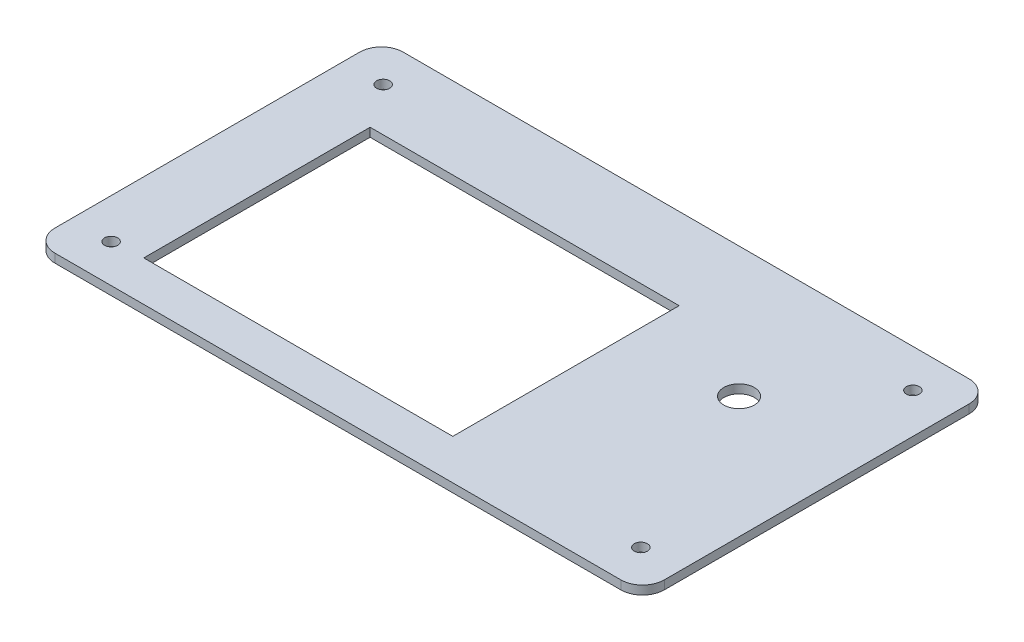
ISO-10303-21;
HEADER;
FILE_DESCRIPTION(('STEP AP214'),'2;1');
FILE_NAME('part.step','',(''),(''),'','','');
FILE_SCHEMA(('AUTOMOTIVE_DESIGN { 1 0 10303 214 1 1 1 1 }'));
ENDSEC;
DATA;
#1=APPLICATION_CONTEXT('core data for automotive mechanical design processes');
#2=APPLICATION_PROTOCOL_DEFINITION('international standard','automotive_design',2000,#1);
#3=PRODUCT_CONTEXT('',#1,'mechanical');
#4=PRODUCT('Part','Part','',(#3));
#5=PRODUCT_RELATED_PRODUCT_CATEGORY('part','',(#4));
#6=PRODUCT_DEFINITION_FORMATION('','',#4);
#7=PRODUCT_DEFINITION_CONTEXT('part definition',#1,'design');
#8=PRODUCT_DEFINITION('design','',#6,#7);
#9=PRODUCT_DEFINITION_SHAPE('','',#8);
#10=(LENGTH_UNIT() NAMED_UNIT(*) SI_UNIT(.MILLI.,.METRE.));
#11=(NAMED_UNIT(*) PLANE_ANGLE_UNIT() SI_UNIT($,.RADIAN.));
#12=(NAMED_UNIT(*) SI_UNIT($,.STERADIAN.) SOLID_ANGLE_UNIT());
#13=UNCERTAINTY_MEASURE_WITH_UNIT(LENGTH_MEASURE(1.E-05),#10,'distance_accuracy_value','');
#14=(GEOMETRIC_REPRESENTATION_CONTEXT(3) GLOBAL_UNCERTAINTY_ASSIGNED_CONTEXT((#13)) GLOBAL_UNIT_ASSIGNED_CONTEXT((#10,
#11,#12)) REPRESENTATION_CONTEXT('',''));
#15=CARTESIAN_POINT('',(0.,0.,0.));
#16=DIRECTION('',(0.,0.,1.));
#17=DIRECTION('',(1.,0.,0.));
#18=AXIS2_PLACEMENT_3D('',#15,#16,#17);
#19=CARTESIAN_POINT('',(-62.2257502177692,2.,-33.5412544692905));
#20=DIRECTION('',(0.,1.,0.));
#21=DIRECTION('',(0.,0.,1.));
#22=AXIS2_PLACEMENT_3D('',#19,#20,#21);
#23=PLANE('',#22);
#24=DIRECTION('',(1.,0.,0.));
#25=VECTOR('',#24,1.);
#26=CARTESIAN_POINT('',(-51.0757502177691,2.,32.2087455307095));
#27=LINE('',#26,#25);
#28=CARTESIAN_POINT('',(-51.0757502177691,2.,32.2087455307095));
#29=VERTEX_POINT('',#28);
#30=CARTESIAN_POINT('',(19.9242497822309,2.,32.2087455307095));
#31=VERTEX_POINT('',#30);
#32=EDGE_CURVE('E130',#29,#31,#27,.T.);
#33=ORIENTED_EDGE('',*,*,#32,.F.);
#34=DIRECTION('',(0.,0.,1.));
#35=VECTOR('',#34,1.);
#36=CARTESIAN_POINT('',(-51.0757502177692,2.,-19.7912544692905));
#37=LINE('',#36,#35);
#38=CARTESIAN_POINT('',(-51.0757502177692,2.,-19.7912544692905));
#39=VERTEX_POINT('',#38);
#40=EDGE_CURVE('E122',#39,#29,#37,.T.);
#41=ORIENTED_EDGE('',*,*,#40,.F.);
#42=DIRECTION('',(-1.,0.,0.));
#43=VECTOR('',#42,1.);
#44=CARTESIAN_POINT('',(-51.0757502177692,2.,-19.7912544692905));
#45=LINE('',#44,#43);
#46=CARTESIAN_POINT('',(19.9242497822308,2.,-19.7912544692905));
#47=VERTEX_POINT('',#46);
#48=EDGE_CURVE('E145',#47,#39,#45,.T.);
#49=ORIENTED_EDGE('',*,*,#48,.F.);
#50=DIRECTION('',(0.,0.,-1.));
#51=VECTOR('',#50,1.);
#52=CARTESIAN_POINT('',(19.9242497822308,2.,-19.7912544692905));
#53=LINE('',#52,#51);
#54=EDGE_CURVE('E143',#31,#47,#53,.T.);
#55=ORIENTED_EDGE('',*,*,#54,.F.);
#56=EDGE_LOOP('',(#33,#41,#49,#55));
#57=FACE_BOUND('',#56,.T.);
#58=CARTESIAN_POINT('',(-58.0757502177692,2.,32.7087455307095));
#59=DIRECTION('',(0.,1.,0.));
#60=DIRECTION('',(0.,0.,1.));
#61=AXIS2_PLACEMENT_3D('',#58,#59,#60);
#62=CIRCLE('',#61,1.5);
#63=CARTESIAN_POINT('',(-58.0757502177692,2.,34.2087455307095));
#64=VERTEX_POINT('',#63);
#65=EDGE_CURVE('E167',#64,#64,#62,.T.);
#66=ORIENTED_EDGE('',*,*,#65,.F.);
#67=EDGE_LOOP('',(#66));
#68=FACE_BOUND('',#67,.T.);
#69=CARTESIAN_POINT('',(-58.0757502177692,2.,-29.7912544692905));
#70=DIRECTION('',(0.,1.,0.));
#71=DIRECTION('',(0.,0.,1.));
#72=AXIS2_PLACEMENT_3D('',#69,#70,#71);
#73=CIRCLE('',#72,1.5);
#74=CARTESIAN_POINT('',(-58.0757502177692,2.,-28.2912544692905));
#75=VERTEX_POINT('',#74);
#76=EDGE_CURVE('E179',#75,#75,#73,.T.);
#77=ORIENTED_EDGE('',*,*,#76,.F.);
#78=EDGE_LOOP('',(#77));
#79=FACE_BOUND('',#78,.T.);
#80=CARTESIAN_POINT('',(-62.2257502177692,2.,-33.5412544692905));
#81=DIRECTION('',(0.,1.,0.));
#82=DIRECTION('',(0.,0.,1.));
#83=AXIS2_PLACEMENT_3D('',#80,#81,#82);
#84=CIRCLE('',#83,5.);
#85=CARTESIAN_POINT('',(-62.2257502177691,2.,-38.5412544692905));
#86=VERTEX_POINT('',#85);
#87=CARTESIAN_POINT('',(-67.2257502177692,2.,-33.5412544692904));
#88=VERTEX_POINT('',#87);
#89=EDGE_CURVE('E185',#86,#88,#84,.T.);
#90=ORIENTED_EDGE('',*,*,#89,.T.);
#91=DIRECTION('',(0.,0.,1.));
#92=VECTOR('',#91,1.);
#93=CARTESIAN_POINT('',(-67.2257502177692,2.,-33.5412544692904));
#94=LINE('',#93,#92);
#95=CARTESIAN_POINT('',(-67.2257502177692,2.,36.4587455307095));
#96=VERTEX_POINT('',#95);
#97=EDGE_CURVE('E188',#88,#96,#94,.T.);
#98=ORIENTED_EDGE('',*,*,#97,.T.);
#99=CARTESIAN_POINT('',(-62.2257502177692,2.,36.4587455307095));
#100=DIRECTION('',(0.,1.,0.));
#101=DIRECTION('',(0.,0.,-1.));
#102=AXIS2_PLACEMENT_3D('',#99,#100,#101);
#103=CIRCLE('',#102,5.);
#104=CARTESIAN_POINT('',(-62.2257502177691,2.,41.4587455307095));
#105=VERTEX_POINT('',#104);
#106=EDGE_CURVE('E191',#96,#105,#103,.T.);
#107=ORIENTED_EDGE('',*,*,#106,.T.);
#108=DIRECTION('',(1.,0.,0.));
#109=VECTOR('',#108,1.);
#110=CARTESIAN_POINT('',(-62.2257502177691,2.,41.4587455307095));
#111=LINE('',#110,#109);
#112=CARTESIAN_POINT('',(67.7742497822308,2.,41.4587455307095));
#113=VERTEX_POINT('',#112);
#114=EDGE_CURVE('E193',#105,#113,#111,.T.);
#115=ORIENTED_EDGE('',*,*,#114,.T.);
#116=CARTESIAN_POINT('',(67.7742497822308,2.,36.4587455307095));
#117=DIRECTION('',(0.,1.,0.));
#118=DIRECTION('',(0.,0.,1.));
#119=AXIS2_PLACEMENT_3D('',#116,#117,#118);
#120=CIRCLE('',#119,5.);
#121=CARTESIAN_POINT('',(72.7742497822309,2.,36.4587455307095));
#122=VERTEX_POINT('',#121);
#123=EDGE_CURVE('E195',#113,#122,#120,.T.);
#124=ORIENTED_EDGE('',*,*,#123,.T.);
#125=DIRECTION('',(0.,0.,-1.));
#126=VECTOR('',#125,1.);
#127=CARTESIAN_POINT('',(72.7742497822309,2.,-33.5412544692904));
#128=LINE('',#127,#126);
#129=CARTESIAN_POINT('',(72.7742497822309,2.,-33.5412544692904));
#130=VERTEX_POINT('',#129);
#131=EDGE_CURVE('E197',#122,#130,#128,.T.);
#132=ORIENTED_EDGE('',*,*,#131,.T.);
#133=CARTESIAN_POINT('',(67.7742497822308,2.,-33.5412544692905));
#134=DIRECTION('',(0.,1.,0.));
#135=DIRECTION('',(0.,0.,1.));
#136=AXIS2_PLACEMENT_3D('',#133,#134,#135);
#137=CIRCLE('',#136,5.);
#138=CARTESIAN_POINT('',(67.7742497822308,2.,-38.5412544692905));
#139=VERTEX_POINT('',#138);
#140=EDGE_CURVE('E199',#130,#139,#137,.T.);
#141=ORIENTED_EDGE('',*,*,#140,.T.);
#142=DIRECTION('',(-1.,0.,0.));
#143=VECTOR('',#142,1.);
#144=CARTESIAN_POINT('',(-62.2257502177691,2.,-38.5412544692905));
#145=LINE('',#144,#143);
#146=EDGE_CURVE('E201',#139,#86,#145,.T.);
#147=ORIENTED_EDGE('',*,*,#146,.T.);
#148=EDGE_LOOP('',(#90,#98,#107,#115,#124,#132,#141,#147));
#149=FACE_BOUND('',#148,.T.);
#150=CARTESIAN_POINT('',(63.6242497822309,2.,-29.7912544692905));
#151=DIRECTION('',(0.,1.,0.));
#152=DIRECTION('',(0.,0.,1.));
#153=AXIS2_PLACEMENT_3D('',#150,#151,#152);
#154=CIRCLE('',#153,1.5);
#155=CARTESIAN_POINT('',(63.6242497822309,2.,-28.2912544692905));
#156=VERTEX_POINT('',#155);
#157=EDGE_CURVE('E173',#156,#156,#154,.T.);
#158=ORIENTED_EDGE('',*,*,#157,.F.);
#159=EDGE_LOOP('',(#158));
#160=FACE_BOUND('',#159,.T.);
#161=CARTESIAN_POINT('',(63.6242497822309,2.,32.7087455307095));
#162=DIRECTION('',(0.,1.,0.));
#163=DIRECTION('',(0.,0.,1.));
#164=AXIS2_PLACEMENT_3D('',#161,#162,#163);
#165=CIRCLE('',#164,1.5);
#166=CARTESIAN_POINT('',(63.6242497822309,2.,34.2087455307095));
#167=VERTEX_POINT('',#166);
#168=EDGE_CURVE('E161',#167,#167,#165,.T.);
#169=ORIENTED_EDGE('',*,*,#168,.F.);
#170=EDGE_LOOP('',(#169));
#171=FACE_BOUND('',#170,.T.);
#172=CARTESIAN_POINT('',(44.830013855976,2.,-8.64873209978428));
#173=DIRECTION('',(0.,1.,0.));
#174=DIRECTION('',(0.,0.,1.));
#175=AXIS2_PLACEMENT_3D('',#172,#173,#174);
#176=CIRCLE('',#175,3.5);
#177=CARTESIAN_POINT('',(44.830013855976,2.,-5.14873209978428));
#178=VERTEX_POINT('',#177);
#179=EDGE_CURVE('E151',#178,#178,#176,.T.);
#180=ORIENTED_EDGE('',*,*,#179,.F.);
#181=EDGE_LOOP('',(#180));
#182=FACE_BOUND('',#181,.T.);
#183=ADVANCED_FACE('F33',(#57,#68,#79,#149,#160,#171,#182),#23,.T.);
#184=CARTESIAN_POINT('',(-62.2257502177692,0.,-33.5412544692905));
#185=DIRECTION('',(0.,1.,0.));
#186=DIRECTION('',(0.,0.,1.));
#187=AXIS2_PLACEMENT_3D('',#184,#185,#186);
#188=PLANE('',#187);
#189=DIRECTION('',(0.,0.,1.));
#190=VECTOR('',#189,1.);
#191=CARTESIAN_POINT('',(-51.0757502177692,0.,-19.7912544692905));
#192=LINE('',#191,#190);
#193=CARTESIAN_POINT('',(-51.0757502177692,0.,-19.7912544692905));
#194=VERTEX_POINT('',#193);
#195=CARTESIAN_POINT('',(-51.0757502177691,0.,32.2087455307095));
#196=VERTEX_POINT('',#195);
#197=EDGE_CURVE('E56',#194,#196,#192,.T.);
#198=ORIENTED_EDGE('',*,*,#197,.T.);
#199=DIRECTION('',(1.,0.,0.));
#200=VECTOR('',#199,1.);
#201=CARTESIAN_POINT('',(-51.0757502177691,0.,32.2087455307095));
#202=LINE('',#201,#200);
#203=CARTESIAN_POINT('',(19.9242497822309,0.,32.2087455307095));
#204=VERTEX_POINT('',#203);
#205=EDGE_CURVE('E137',#196,#204,#202,.T.);
#206=ORIENTED_EDGE('',*,*,#205,.T.);
#207=DIRECTION('',(0.,0.,-1.));
#208=VECTOR('',#207,1.);
#209=CARTESIAN_POINT('',(19.9242497822308,0.,-19.7912544692905));
#210=LINE('',#209,#208);
#211=CARTESIAN_POINT('',(19.9242497822308,0.,-19.7912544692905));
#212=VERTEX_POINT('',#211);
#213=EDGE_CURVE('E153',#204,#212,#210,.T.);
#214=ORIENTED_EDGE('',*,*,#213,.T.);
#215=DIRECTION('',(-1.,0.,0.));
#216=VECTOR('',#215,1.);
#217=CARTESIAN_POINT('',(-51.0757502177692,0.,-19.7912544692905));
#218=LINE('',#217,#216);
#219=EDGE_CURVE('E131',#212,#194,#218,.T.);
#220=ORIENTED_EDGE('',*,*,#219,.T.);
#221=EDGE_LOOP('',(#198,#206,#214,#220));
#222=FACE_BOUND('',#221,.T.);
#223=CARTESIAN_POINT('',(-58.0757502177692,0.,32.7087455307095));
#224=DIRECTION('',(0.,1.,0.));
#225=DIRECTION('',(0.,0.,1.));
#226=AXIS2_PLACEMENT_3D('',#223,#224,#225);
#227=CIRCLE('',#226,1.5);
#228=CARTESIAN_POINT('',(-58.0757502177692,0.,34.2087455307095));
#229=VERTEX_POINT('',#228);
#230=EDGE_CURVE('E164',#229,#229,#227,.T.);
#231=ORIENTED_EDGE('',*,*,#230,.T.);
#232=EDGE_LOOP('',(#231));
#233=FACE_BOUND('',#232,.T.);
#234=CARTESIAN_POINT('',(-58.0757502177692,0.,-29.7912544692905));
#235=DIRECTION('',(0.,1.,0.));
#236=DIRECTION('',(0.,0.,1.));
#237=AXIS2_PLACEMENT_3D('',#234,#235,#236);
#238=CIRCLE('',#237,1.5);
#239=CARTESIAN_POINT('',(-58.0757502177692,0.,-28.2912544692905));
#240=VERTEX_POINT('',#239);
#241=EDGE_CURVE('E176',#240,#240,#238,.T.);
#242=ORIENTED_EDGE('',*,*,#241,.T.);
#243=EDGE_LOOP('',(#242));
#244=FACE_BOUND('',#243,.T.);
#245=CARTESIAN_POINT('',(-62.2257502177692,0.,-33.5412544692905));
#246=DIRECTION('',(0.,1.,0.));
#247=DIRECTION('',(0.,0.,1.));
#248=AXIS2_PLACEMENT_3D('',#245,#246,#247);
#249=CIRCLE('',#248,5.);
#250=CARTESIAN_POINT('',(-62.2257502177691,0.,-38.5412544692905));
#251=VERTEX_POINT('',#250);
#252=CARTESIAN_POINT('',(-67.2257502177692,0.,-33.5412544692904));
#253=VERTEX_POINT('',#252);
#254=EDGE_CURVE('E182',#251,#253,#249,.T.);
#255=ORIENTED_EDGE('',*,*,#254,.F.);
#256=DIRECTION('',(-1.,0.,0.));
#257=VECTOR('',#256,1.);
#258=CARTESIAN_POINT('',(-62.2257502177691,0.,-38.5412544692905));
#259=LINE('',#258,#257);
#260=CARTESIAN_POINT('',(67.7742497822308,0.,-38.5412544692905));
#261=VERTEX_POINT('',#260);
#262=EDGE_CURVE('E189',#261,#251,#259,.T.);
#263=ORIENTED_EDGE('',*,*,#262,.F.);
#264=CARTESIAN_POINT('',(67.7742497822308,0.,-33.5412544692905));
#265=DIRECTION('',(0.,1.,0.));
#266=DIRECTION('',(0.,0.,1.));
#267=AXIS2_PLACEMENT_3D('',#264,#265,#266);
#268=CIRCLE('',#267,5.);
#269=CARTESIAN_POINT('',(72.7742497822309,0.,-33.5412544692904));
#270=VERTEX_POINT('',#269);
#271=EDGE_CURVE('E216',#270,#261,#268,.T.);
#272=ORIENTED_EDGE('',*,*,#271,.F.);
#273=DIRECTION('',(0.,0.,-1.));
#274=VECTOR('',#273,1.);
#275=CARTESIAN_POINT('',(72.7742497822309,0.,-33.5412544692904));
#276=LINE('',#275,#274);
#277=CARTESIAN_POINT('',(72.7742497822309,0.,36.4587455307095));
#278=VERTEX_POINT('',#277);
#279=EDGE_CURVE('E214',#278,#270,#276,.T.);
#280=ORIENTED_EDGE('',*,*,#279,.F.);
#281=CARTESIAN_POINT('',(67.7742497822308,0.,36.4587455307095));
#282=DIRECTION('',(0.,1.,0.));
#283=DIRECTION('',(0.,0.,1.));
#284=AXIS2_PLACEMENT_3D('',#281,#282,#283);
#285=CIRCLE('',#284,5.);
#286=CARTESIAN_POINT('',(67.7742497822308,0.,41.4587455307095));
#287=VERTEX_POINT('',#286);
#288=EDGE_CURVE('E212',#287,#278,#285,.T.);
#289=ORIENTED_EDGE('',*,*,#288,.F.);
#290=DIRECTION('',(1.,0.,0.));
#291=VECTOR('',#290,1.);
#292=CARTESIAN_POINT('',(-62.2257502177691,0.,41.4587455307095));
#293=LINE('',#292,#291);
#294=CARTESIAN_POINT('',(-62.2257502177691,0.,41.4587455307095));
#295=VERTEX_POINT('',#294);
#296=EDGE_CURVE('E210',#295,#287,#293,.T.);
#297=ORIENTED_EDGE('',*,*,#296,.F.);
#298=CARTESIAN_POINT('',(-62.2257502177692,0.,36.4587455307095));
#299=DIRECTION('',(0.,1.,0.));
#300=DIRECTION('',(0.,0.,-1.));
#301=AXIS2_PLACEMENT_3D('',#298,#299,#300);
#302=CIRCLE('',#301,5.);
#303=CARTESIAN_POINT('',(-67.2257502177692,0.,36.4587455307095));
#304=VERTEX_POINT('',#303);
#305=EDGE_CURVE('E208',#304,#295,#302,.T.);
#306=ORIENTED_EDGE('',*,*,#305,.F.);
#307=DIRECTION('',(0.,0.,1.));
#308=VECTOR('',#307,1.);
#309=CARTESIAN_POINT('',(-67.2257502177692,0.,-33.5412544692904));
#310=LINE('',#309,#308);
#311=EDGE_CURVE('E206',#253,#304,#310,.T.);
#312=ORIENTED_EDGE('',*,*,#311,.F.);
#313=EDGE_LOOP('',(#255,#263,#272,#280,#289,#297,#306,#312));
#314=FACE_BOUND('',#313,.T.);
#315=CARTESIAN_POINT('',(63.6242497822309,0.,-29.7912544692905));
#316=DIRECTION('',(0.,1.,0.));
#317=DIRECTION('',(0.,0.,1.));
#318=AXIS2_PLACEMENT_3D('',#315,#316,#317);
#319=CIRCLE('',#318,1.5);
#320=CARTESIAN_POINT('',(63.6242497822309,0.,-28.2912544692905));
#321=VERTEX_POINT('',#320);
#322=EDGE_CURVE('E170',#321,#321,#319,.T.);
#323=ORIENTED_EDGE('',*,*,#322,.T.);
#324=EDGE_LOOP('',(#323));
#325=FACE_BOUND('',#324,.T.);
#326=CARTESIAN_POINT('',(63.6242497822309,0.,32.7087455307095));
#327=DIRECTION('',(0.,1.,0.));
#328=DIRECTION('',(0.,0.,1.));
#329=AXIS2_PLACEMENT_3D('',#326,#327,#328);
#330=CIRCLE('',#329,1.5);
#331=CARTESIAN_POINT('',(63.6242497822309,0.,34.2087455307095));
#332=VERTEX_POINT('',#331);
#333=EDGE_CURVE('E138',#332,#332,#330,.T.);
#334=ORIENTED_EDGE('',*,*,#333,.T.);
#335=EDGE_LOOP('',(#334));
#336=FACE_BOUND('',#335,.T.);
#337=CARTESIAN_POINT('',(44.830013855976,0.,-8.64873209978428));
#338=DIRECTION('',(0.,1.,0.));
#339=DIRECTION('',(0.,0.,1.));
#340=AXIS2_PLACEMENT_3D('',#337,#338,#339);
#341=CIRCLE('',#340,3.5);
#342=CARTESIAN_POINT('',(44.830013855976,0.,-5.14873209978428));
#343=VERTEX_POINT('',#342);
#344=EDGE_CURVE('E345',#343,#343,#341,.T.);
#345=ORIENTED_EDGE('',*,*,#344,.T.);
#346=EDGE_LOOP('',(#345));
#347=FACE_BOUND('',#346,.T.);
#348=ADVANCED_FACE('F246',(#222,#233,#244,#314,#325,#336,#347),#188,.F.);
#349=CARTESIAN_POINT('',(-62.2257502177692,2.,-33.5412544692905));
#350=DIRECTION('',(0.,-1.,0.));
#351=DIRECTION('',(0.,0.,-1.));
#352=AXIS2_PLACEMENT_3D('',#349,#350,#351);
#353=CYLINDRICAL_SURFACE('',#352,5.);
#354=ORIENTED_EDGE('',*,*,#254,.T.);
#355=DIRECTION('',(0.,-1.,0.));
#356=VECTOR('',#355,1.);
#357=CARTESIAN_POINT('',(-67.2257502177692,2.,-33.5412544692904));
#358=LINE('',#357,#356);
#359=EDGE_CURVE('E11',#88,#253,#358,.T.);
#360=ORIENTED_EDGE('',*,*,#359,.F.);
#361=ORIENTED_EDGE('',*,*,#89,.F.);
#362=DIRECTION('',(0.,-1.,0.));
#363=VECTOR('',#362,1.);
#364=CARTESIAN_POINT('',(-62.2257502177691,2.,-38.5412544692905));
#365=LINE('',#364,#363);
#366=EDGE_CURVE('E203',#86,#251,#365,.T.);
#367=ORIENTED_EDGE('',*,*,#366,.T.);
#368=EDGE_LOOP('',(#354,#360,#361,#367));
#369=FACE_BOUND('',#368,.T.);
#370=ADVANCED_FACE('F35',(#369),#353,.T.);
#371=CARTESIAN_POINT('',(-67.2257502177692,2.,-33.5412544692904));
#372=DIRECTION('',(1.,0.,0.));
#373=DIRECTION('',(0.,0.,-1.));
#374=AXIS2_PLACEMENT_3D('',#371,#372,#373);
#375=PLANE('',#374);
#376=ORIENTED_EDGE('',*,*,#311,.T.);
#377=DIRECTION('',(0.,-1.,0.));
#378=VECTOR('',#377,1.);
#379=CARTESIAN_POINT('',(-67.2257502177692,2.,36.4587455307095));
#380=LINE('',#379,#378);
#381=EDGE_CURVE('E41',#96,#304,#380,.T.);
#382=ORIENTED_EDGE('',*,*,#381,.F.);
#383=ORIENTED_EDGE('',*,*,#97,.F.);
#384=ORIENTED_EDGE('',*,*,#359,.T.);
#385=EDGE_LOOP('',(#376,#382,#383,#384));
#386=FACE_BOUND('',#385,.T.);
#387=ADVANCED_FACE('F264',(#386),#375,.F.);
#388=CARTESIAN_POINT('',(-62.2257502177692,2.,36.4587455307095));
#389=DIRECTION('',(0.,-1.,0.));
#390=DIRECTION('',(0.,0.,-1.));
#391=AXIS2_PLACEMENT_3D('',#388,#389,#390);
#392=CYLINDRICAL_SURFACE('',#391,5.);
#393=ORIENTED_EDGE('',*,*,#305,.T.);
#394=DIRECTION('',(0.,-1.,0.));
#395=VECTOR('',#394,1.);
#396=CARTESIAN_POINT('',(-62.2257502177691,2.,41.4587455307095));
#397=LINE('',#396,#395);
#398=EDGE_CURVE('E233',#105,#295,#397,.T.);
#399=ORIENTED_EDGE('',*,*,#398,.F.);
#400=ORIENTED_EDGE('',*,*,#106,.F.);
#401=ORIENTED_EDGE('',*,*,#381,.T.);
#402=EDGE_LOOP('',(#393,#399,#400,#401));
#403=FACE_BOUND('',#402,.T.);
#404=ADVANCED_FACE('F240',(#403),#392,.T.);
#405=CARTESIAN_POINT('',(-62.2257502177691,2.,41.4587455307095));
#406=DIRECTION('',(0.,0.,-1.));
#407=DIRECTION('',(-1.,0.,0.));
#408=AXIS2_PLACEMENT_3D('',#405,#406,#407);
#409=PLANE('',#408);
#410=ORIENTED_EDGE('',*,*,#296,.T.);
#411=DIRECTION('',(0.,-1.,0.));
#412=VECTOR('',#411,1.);
#413=CARTESIAN_POINT('',(67.7742497822308,2.,41.4587455307095));
#414=LINE('',#413,#412);
#415=EDGE_CURVE('E230',#113,#287,#414,.T.);
#416=ORIENTED_EDGE('',*,*,#415,.F.);
#417=ORIENTED_EDGE('',*,*,#114,.F.);
#418=ORIENTED_EDGE('',*,*,#398,.T.);
#419=EDGE_LOOP('',(#410,#416,#417,#418));
#420=FACE_BOUND('',#419,.T.);
#421=ADVANCED_FACE('F252',(#420),#409,.F.);
#422=CARTESIAN_POINT('',(67.7742497822308,2.,36.4587455307095));
#423=DIRECTION('',(0.,-1.,0.));
#424=DIRECTION('',(0.,0.,-1.));
#425=AXIS2_PLACEMENT_3D('',#422,#423,#424);
#426=CYLINDRICAL_SURFACE('',#425,5.);
#427=ORIENTED_EDGE('',*,*,#288,.T.);
#428=DIRECTION('',(0.,-1.,0.));
#429=VECTOR('',#428,1.);
#430=CARTESIAN_POINT('',(72.7742497822309,2.,36.4587455307095));
#431=LINE('',#430,#429);
#432=EDGE_CURVE('E227',#122,#278,#431,.T.);
#433=ORIENTED_EDGE('',*,*,#432,.F.);
#434=ORIENTED_EDGE('',*,*,#123,.F.);
#435=ORIENTED_EDGE('',*,*,#415,.T.);
#436=EDGE_LOOP('',(#427,#433,#434,#435));
#437=FACE_BOUND('',#436,.T.);
#438=ADVANCED_FACE('F256',(#437),#426,.T.);
#439=CARTESIAN_POINT('',(72.7742497822309,2.,-33.5412544692904));
#440=DIRECTION('',(-1.,0.,0.));
#441=DIRECTION('',(0.,0.,1.));
#442=AXIS2_PLACEMENT_3D('',#439,#440,#441);
#443=PLANE('',#442);
#444=ORIENTED_EDGE('',*,*,#279,.T.);
#445=DIRECTION('',(0.,-1.,0.));
#446=VECTOR('',#445,1.);
#447=CARTESIAN_POINT('',(72.7742497822309,2.,-33.5412544692904));
#448=LINE('',#447,#446);
#449=EDGE_CURVE('E224',#130,#270,#448,.T.);
#450=ORIENTED_EDGE('',*,*,#449,.F.);
#451=ORIENTED_EDGE('',*,*,#131,.F.);
#452=ORIENTED_EDGE('',*,*,#432,.T.);
#453=EDGE_LOOP('',(#444,#450,#451,#452));
#454=FACE_BOUND('',#453,.T.);
#455=ADVANCED_FACE('F277',(#454),#443,.F.);
#456=CARTESIAN_POINT('',(67.7742497822308,2.,-33.5412544692905));
#457=DIRECTION('',(0.,-1.,0.));
#458=DIRECTION('',(0.,0.,-1.));
#459=AXIS2_PLACEMENT_3D('',#456,#457,#458);
#460=CYLINDRICAL_SURFACE('',#459,5.);
#461=ORIENTED_EDGE('',*,*,#271,.T.);
#462=DIRECTION('',(0.,-1.,0.));
#463=VECTOR('',#462,1.);
#464=CARTESIAN_POINT('',(67.7742497822308,2.,-38.5412544692905));
#465=LINE('',#464,#463);
#466=EDGE_CURVE('E221',#139,#261,#465,.T.);
#467=ORIENTED_EDGE('',*,*,#466,.F.);
#468=ORIENTED_EDGE('',*,*,#140,.F.);
#469=ORIENTED_EDGE('',*,*,#449,.T.);
#470=EDGE_LOOP('',(#461,#467,#468,#469));
#471=FACE_BOUND('',#470,.T.);
#472=ADVANCED_FACE('F275',(#471),#460,.T.);
#473=CARTESIAN_POINT('',(-62.2257502177691,2.,-38.5412544692905));
#474=DIRECTION('',(0.,0.,1.));
#475=DIRECTION('',(1.,0.,0.));
#476=AXIS2_PLACEMENT_3D('',#473,#474,#475);
#477=PLANE('',#476);
#478=ORIENTED_EDGE('',*,*,#262,.T.);
#479=ORIENTED_EDGE('',*,*,#366,.F.);
#480=ORIENTED_EDGE('',*,*,#146,.F.);
#481=ORIENTED_EDGE('',*,*,#466,.T.);
#482=EDGE_LOOP('',(#478,#479,#480,#481));
#483=FACE_BOUND('',#482,.T.);
#484=ADVANCED_FACE('F270',(#483),#477,.F.);
#485=CARTESIAN_POINT('',(-58.0757502177692,2.,-29.7912544692905));
#486=DIRECTION('',(0.,-1.,0.));
#487=DIRECTION('',(0.,0.,-1.));
#488=AXIS2_PLACEMENT_3D('',#485,#486,#487);
#489=CYLINDRICAL_SURFACE('',#488,1.5);
#490=ORIENTED_EDGE('',*,*,#76,.T.);
#491=EDGE_LOOP('',(#490));
#492=FACE_BOUND('',#491,.T.);
#493=ORIENTED_EDGE('',*,*,#241,.F.);
#494=EDGE_LOOP('',(#493));
#495=FACE_BOUND('',#494,.T.);
#496=ADVANCED_FACE('F294',(#492,#495),#489,.F.);
#497=CARTESIAN_POINT('',(63.6242497822309,2.,-29.7912544692905));
#498=DIRECTION('',(0.,-1.,0.));
#499=DIRECTION('',(0.,0.,-1.));
#500=AXIS2_PLACEMENT_3D('',#497,#498,#499);
#501=CYLINDRICAL_SURFACE('',#500,1.5);
#502=ORIENTED_EDGE('',*,*,#157,.T.);
#503=EDGE_LOOP('',(#502));
#504=FACE_BOUND('',#503,.T.);
#505=ORIENTED_EDGE('',*,*,#322,.F.);
#506=EDGE_LOOP('',(#505));
#507=FACE_BOUND('',#506,.T.);
#508=ADVANCED_FACE('F301',(#504,#507),#501,.F.);
#509=CARTESIAN_POINT('',(-58.0757502177692,2.,32.7087455307095));
#510=DIRECTION('',(0.,-1.,0.));
#511=DIRECTION('',(0.,0.,-1.));
#512=AXIS2_PLACEMENT_3D('',#509,#510,#511);
#513=CYLINDRICAL_SURFACE('',#512,1.5);
#514=ORIENTED_EDGE('',*,*,#65,.T.);
#515=EDGE_LOOP('',(#514));
#516=FACE_BOUND('',#515,.T.);
#517=ORIENTED_EDGE('',*,*,#230,.F.);
#518=EDGE_LOOP('',(#517));
#519=FACE_BOUND('',#518,.T.);
#520=ADVANCED_FACE('F306',(#516,#519),#513,.F.);
#521=CARTESIAN_POINT('',(63.6242497822309,2.,32.7087455307095));
#522=DIRECTION('',(0.,-1.,0.));
#523=DIRECTION('',(0.,0.,-1.));
#524=AXIS2_PLACEMENT_3D('',#521,#522,#523);
#525=CYLINDRICAL_SURFACE('',#524,1.5);
#526=ORIENTED_EDGE('',*,*,#168,.T.);
#527=EDGE_LOOP('',(#526));
#528=FACE_BOUND('',#527,.T.);
#529=ORIENTED_EDGE('',*,*,#333,.F.);
#530=EDGE_LOOP('',(#529));
#531=FACE_BOUND('',#530,.T.);
#532=ADVANCED_FACE('F316',(#528,#531),#525,.F.);
#533=CARTESIAN_POINT('',(-51.0757502177692,2.,-19.7912544692905));
#534=DIRECTION('',(1.,0.,0.));
#535=DIRECTION('',(0.,0.,-1.));
#536=AXIS2_PLACEMENT_3D('',#533,#534,#535);
#537=PLANE('',#536);
#538=ORIENTED_EDGE('',*,*,#197,.F.);
#539=DIRECTION('',(0.,-1.,0.));
#540=VECTOR('',#539,1.);
#541=CARTESIAN_POINT('',(-51.0757502177692,2.,-19.7912544692905));
#542=LINE('',#541,#540);
#543=EDGE_CURVE('E126',#39,#194,#542,.T.);
#544=ORIENTED_EDGE('',*,*,#543,.F.);
#545=ORIENTED_EDGE('',*,*,#40,.T.);
#546=DIRECTION('',(0.,-1.,0.));
#547=VECTOR('',#546,1.);
#548=CARTESIAN_POINT('',(-51.0757502177691,2.,32.2087455307095));
#549=LINE('',#548,#547);
#550=EDGE_CURVE('E125',#29,#196,#549,.T.);
#551=ORIENTED_EDGE('',*,*,#550,.T.);
#552=EDGE_LOOP('',(#538,#544,#545,#551));
#553=FACE_BOUND('',#552,.T.);
#554=ADVANCED_FACE('F124',(#553),#537,.T.);
#555=CARTESIAN_POINT('',(-51.0757502177691,2.,32.2087455307095));
#556=DIRECTION('',(0.,0.,-1.));
#557=DIRECTION('',(-1.,0.,0.));
#558=AXIS2_PLACEMENT_3D('',#555,#556,#557);
#559=PLANE('',#558);
#560=ORIENTED_EDGE('',*,*,#205,.F.);
#561=ORIENTED_EDGE('',*,*,#550,.F.);
#562=ORIENTED_EDGE('',*,*,#32,.T.);
#563=DIRECTION('',(0.,-1.,0.));
#564=VECTOR('',#563,1.);
#565=CARTESIAN_POINT('',(19.9242497822309,2.,32.2087455307095));
#566=LINE('',#565,#564);
#567=EDGE_CURVE('E139',#31,#204,#566,.T.);
#568=ORIENTED_EDGE('',*,*,#567,.T.);
#569=EDGE_LOOP('',(#560,#561,#562,#568));
#570=FACE_BOUND('',#569,.T.);
#571=ADVANCED_FACE('F134',(#570),#559,.T.);
#572=CARTESIAN_POINT('',(19.9242497822308,2.,-19.7912544692905));
#573=DIRECTION('',(-1.,0.,0.));
#574=DIRECTION('',(0.,0.,1.));
#575=AXIS2_PLACEMENT_3D('',#572,#573,#574);
#576=PLANE('',#575);
#577=ORIENTED_EDGE('',*,*,#213,.F.);
#578=ORIENTED_EDGE('',*,*,#567,.F.);
#579=ORIENTED_EDGE('',*,*,#54,.T.);
#580=DIRECTION('',(0.,-1.,0.));
#581=VECTOR('',#580,1.);
#582=CARTESIAN_POINT('',(19.9242497822308,2.,-19.7912544692905));
#583=LINE('',#582,#581);
#584=EDGE_CURVE('E48',#47,#212,#583,.T.);
#585=ORIENTED_EDGE('',*,*,#584,.T.);
#586=EDGE_LOOP('',(#577,#578,#579,#585));
#587=FACE_BOUND('',#586,.T.);
#588=ADVANCED_FACE('F328',(#587),#576,.T.);
#589=CARTESIAN_POINT('',(-51.0757502177692,2.,-19.7912544692905));
#590=DIRECTION('',(0.,0.,1.));
#591=DIRECTION('',(1.,0.,0.));
#592=AXIS2_PLACEMENT_3D('',#589,#590,#591);
#593=PLANE('',#592);
#594=ORIENTED_EDGE('',*,*,#219,.F.);
#595=ORIENTED_EDGE('',*,*,#584,.F.);
#596=ORIENTED_EDGE('',*,*,#48,.T.);
#597=ORIENTED_EDGE('',*,*,#543,.T.);
#598=EDGE_LOOP('',(#594,#595,#596,#597));
#599=FACE_BOUND('',#598,.T.);
#600=ADVANCED_FACE('F331',(#599),#593,.T.);
#601=CARTESIAN_POINT('',(44.830013855976,2.,-8.64873209978428));
#602=DIRECTION('',(0.,-1.,0.));
#603=DIRECTION('',(0.,0.,-1.));
#604=AXIS2_PLACEMENT_3D('',#601,#602,#603);
#605=CYLINDRICAL_SURFACE('',#604,3.5);
#606=ORIENTED_EDGE('',*,*,#179,.T.);
#607=EDGE_LOOP('',(#606));
#608=FACE_BOUND('',#607,.T.);
#609=ORIENTED_EDGE('',*,*,#344,.F.);
#610=EDGE_LOOP('',(#609));
#611=FACE_BOUND('',#610,.T.);
#612=ADVANCED_FACE('F335',(#608,#611),#605,.F.);
#613=CLOSED_SHELL('',(#183,#348,#370,#387,#404,#421,#438,#455,#472,#484,#496,#508,#520,#532,
#554,#571,#588,#600,#612));
#614=MANIFOLD_SOLID_BREP('B2',#613);
#615=ADVANCED_BREP_SHAPE_REPRESENTATION('',(#18,#614),#14);
#616=SHAPE_DEFINITION_REPRESENTATION(#9,#615);
ENDSEC;
END-ISO-10303-21;
